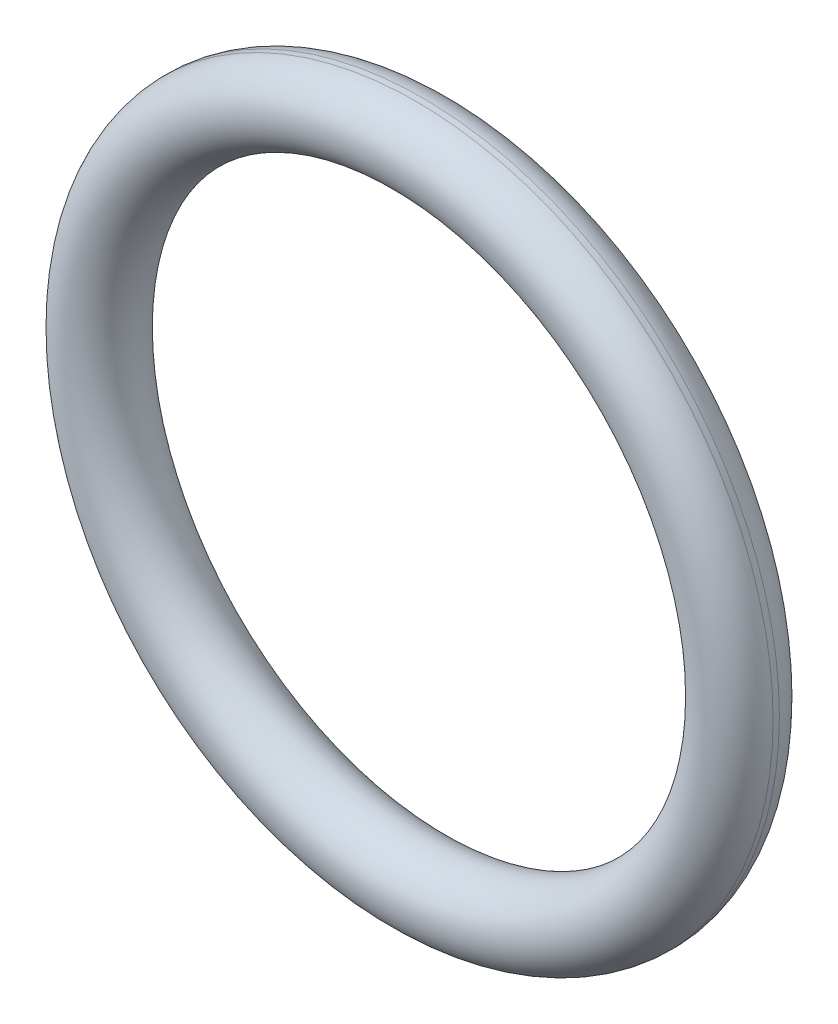
ISO-10303-21;
HEADER;
FILE_DESCRIPTION(('STEP AP214'),'2;1');
FILE_NAME('part.step','',(''),(''),'','','');
FILE_SCHEMA(('AUTOMOTIVE_DESIGN { 1 0 10303 214 1 1 1 1 }'));
ENDSEC;
DATA;
#1=APPLICATION_CONTEXT('core data for automotive mechanical design processes');
#2=APPLICATION_PROTOCOL_DEFINITION('international standard','automotive_design',2000,#1);
#3=PRODUCT_CONTEXT('',#1,'mechanical');
#4=PRODUCT('Part','Part','',(#3));
#5=PRODUCT_RELATED_PRODUCT_CATEGORY('part','',(#4));
#6=PRODUCT_DEFINITION_FORMATION('','',#4);
#7=PRODUCT_DEFINITION_CONTEXT('part definition',#1,'design');
#8=PRODUCT_DEFINITION('design','',#6,#7);
#9=PRODUCT_DEFINITION_SHAPE('','',#8);
#10=(LENGTH_UNIT() NAMED_UNIT(*) SI_UNIT(.MILLI.,.METRE.));
#11=(NAMED_UNIT(*) PLANE_ANGLE_UNIT() SI_UNIT($,.RADIAN.));
#12=(NAMED_UNIT(*) SI_UNIT($,.STERADIAN.) SOLID_ANGLE_UNIT());
#13=UNCERTAINTY_MEASURE_WITH_UNIT(LENGTH_MEASURE(1.E-05),#10,'distance_accuracy_value','');
#14=(GEOMETRIC_REPRESENTATION_CONTEXT(3) GLOBAL_UNCERTAINTY_ASSIGNED_CONTEXT((#13)) GLOBAL_UNIT_ASSIGNED_CONTEXT((#10,
#11,#12)) REPRESENTATION_CONTEXT('',''));
#15=CARTESIAN_POINT('',(0.,0.,0.));
#16=DIRECTION('',(0.,0.,1.));
#17=DIRECTION('',(1.,0.,0.));
#18=AXIS2_PLACEMENT_3D('',#15,#16,#17);
#19=CARTESIAN_POINT('',(0.,0.,0.));
#20=DIRECTION('',(0.,0.,1.));
#21=DIRECTION('',(1.,0.,0.));
#22=AXIS2_PLACEMENT_3D('',#19,#20,#21);
#23=TOROIDAL_SURFACE('',#22,25.5104348142247,3.);
#24=CARTESIAN_POINT('',(0.,0.,-0.25));
#25=DIRECTION('',(0.,0.,1.));
#26=DIRECTION('',(1.,0.,0.));
#27=AXIS2_PLACEMENT_3D('',#24,#25,#26);
#28=CIRCLE('',#27,28.5);
#29=CARTESIAN_POINT('',(28.5,0.,-0.25));
#30=VERTEX_POINT('',#29);
#31=EDGE_CURVE('E10',#30,#30,#28,.T.);
#32=ORIENTED_EDGE('',*,*,#31,.F.);
#33=EDGE_LOOP('',(#32));
#34=FACE_BOUND('',#33,.T.);
#35=CARTESIAN_POINT('',(0.,0.,0.25));
#36=DIRECTION('',(0.,0.,1.));
#37=DIRECTION('',(1.,0.,0.));
#38=AXIS2_PLACEMENT_3D('',#35,#36,#37);
#39=CIRCLE('',#38,28.5);
#40=CARTESIAN_POINT('',(28.5,0.,0.25));
#41=VERTEX_POINT('',#40);
#42=EDGE_CURVE('E39',#41,#41,#39,.T.);
#43=ORIENTED_EDGE('',*,*,#42,.T.);
#44=EDGE_LOOP('',(#43));
#45=FACE_BOUND('',#44,.T.);
#46=ADVANCED_FACE('F33',(#34,#45),#23,.T.);
#47=CARTESIAN_POINT('',(0.,0.,0.));
#48=DIRECTION('',(0.,0.,1.));
#49=DIRECTION('',(1.,0.,0.));
#50=AXIS2_PLACEMENT_3D('',#47,#48,#49);
#51=CYLINDRICAL_SURFACE('',#50,28.5);
#52=ORIENTED_EDGE('',*,*,#42,.F.);
#53=EDGE_LOOP('',(#52));
#54=FACE_BOUND('',#53,.T.);
#55=ORIENTED_EDGE('',*,*,#31,.T.);
#56=EDGE_LOOP('',(#55));
#57=FACE_BOUND('',#56,.T.);
#58=ADVANCED_FACE('F46',(#54,#57),#51,.T.);
#59=CLOSED_SHELL('',(#46,#58));
#60=MANIFOLD_SOLID_BREP('B2',#59);
#61=ADVANCED_BREP_SHAPE_REPRESENTATION('',(#18,#60),#14);
#62=SHAPE_DEFINITION_REPRESENTATION(#9,#61);
ENDSEC;
END-ISO-10303-21;
